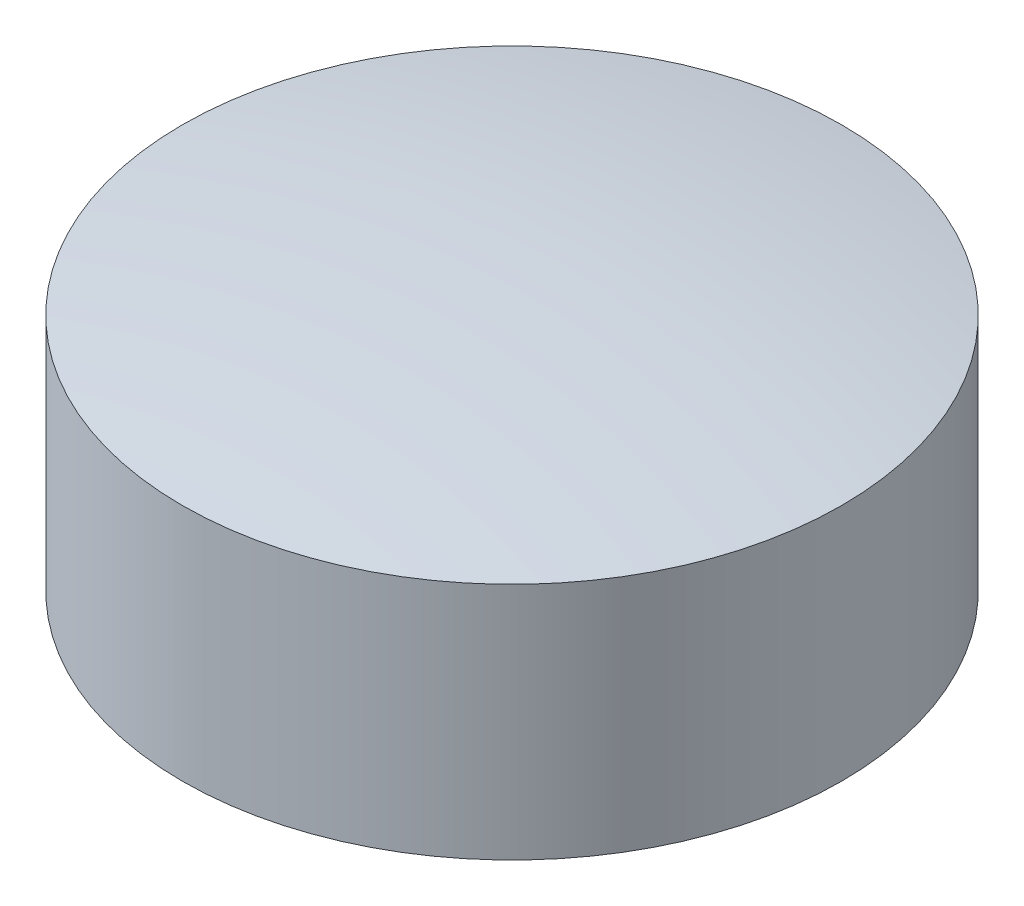
ISO-10303-21;
HEADER;
FILE_DESCRIPTION(('STEP AP214'),'2;1');
FILE_NAME('part.step','',(''),(''),'','','');
FILE_SCHEMA(('AUTOMOTIVE_DESIGN { 1 0 10303 214 1 1 1 1 }'));
ENDSEC;
DATA;
#1=APPLICATION_CONTEXT('core data for automotive mechanical design processes');
#2=APPLICATION_PROTOCOL_DEFINITION('international standard','automotive_design',2000,#1);
#3=PRODUCT_CONTEXT('',#1,'mechanical');
#4=PRODUCT('Part','Part','',(#3));
#5=PRODUCT_RELATED_PRODUCT_CATEGORY('part','',(#4));
#6=PRODUCT_DEFINITION_FORMATION('','',#4);
#7=PRODUCT_DEFINITION_CONTEXT('part definition',#1,'design');
#8=PRODUCT_DEFINITION('design','',#6,#7);
#9=PRODUCT_DEFINITION_SHAPE('','',#8);
#10=(LENGTH_UNIT() NAMED_UNIT(*) SI_UNIT(.MILLI.,.METRE.));
#11=(NAMED_UNIT(*) PLANE_ANGLE_UNIT() SI_UNIT($,.RADIAN.));
#12=(NAMED_UNIT(*) SI_UNIT($,.STERADIAN.) SOLID_ANGLE_UNIT());
#13=UNCERTAINTY_MEASURE_WITH_UNIT(LENGTH_MEASURE(1.E-05),#10,'distance_accuracy_value','');
#14=(GEOMETRIC_REPRESENTATION_CONTEXT(3) GLOBAL_UNCERTAINTY_ASSIGNED_CONTEXT((#13)) GLOBAL_UNIT_ASSIGNED_CONTEXT((#10,
#11,#12)) REPRESENTATION_CONTEXT('',''));
#15=CARTESIAN_POINT('',(0.,0.,0.));
#16=DIRECTION('',(0.,0.,1.));
#17=DIRECTION('',(1.,0.,0.));
#18=AXIS2_PLACEMENT_3D('',#15,#16,#17);
#19=CARTESIAN_POINT('',(14.8,0.,0.));
#20=DIRECTION('',(0.,1.,0.));
#21=DIRECTION('',(0.,0.,1.));
#22=AXIS2_PLACEMENT_3D('',#19,#20,#21);
#23=PLANE('',#22);
#24=CARTESIAN_POINT('',(0.,0.,0.));
#25=DIRECTION('',(0.,1.,0.));
#26=DIRECTION('',(0.,0.,1.));
#27=AXIS2_PLACEMENT_3D('',#24,#25,#26);
#28=CIRCLE('',#27,14.8);
#29=CARTESIAN_POINT('',(0.,0.,14.8));
#30=VERTEX_POINT('',#29);
#31=EDGE_CURVE('E17',#30,#30,#28,.T.);
#32=ORIENTED_EDGE('',*,*,#31,.F.);
#33=EDGE_LOOP('',(#32));
#34=FACE_BOUND('',#33,.T.);
#35=ADVANCED_FACE('F14',(#34),#23,.F.);
#36=CARTESIAN_POINT('',(3.06612374378901E-13,-67.899999999997,0.));
#37=DIRECTION('',(1.,0.,0.));
#38=DIRECTION('',(0.,0.,1.));
#39=AXIS2_PLACEMENT_3D('',#36,#37,#38);
#40=SPHERICAL_SURFACE('',#39,80.);
#41=CARTESIAN_POINT('',(0.,10.7190816532475,0.));
#42=DIRECTION('',(0.,1.,0.));
#43=DIRECTION('',(0.,0.,1.));
#44=AXIS2_PLACEMENT_3D('',#41,#42,#43);
#45=CIRCLE('',#44,14.8);
#46=CARTESIAN_POINT('',(0.,10.7190816532475,14.8));
#47=VERTEX_POINT('',#46);
#48=EDGE_CURVE('E10',#47,#47,#45,.F.);
#49=ORIENTED_EDGE('',*,*,#48,.F.);
#50=EDGE_LOOP('',(#49));
#51=FACE_BOUND('',#50,.T.);
#52=ADVANCED_FACE('F26',(#51),#40,.T.);
#53=CARTESIAN_POINT('',(0.,0.,0.));
#54=DIRECTION('',(0.,1.,0.));
#55=DIRECTION('',(0.,0.,1.));
#56=AXIS2_PLACEMENT_3D('',#53,#54,#55);
#57=CYLINDRICAL_SURFACE('',#56,14.8);
#58=ORIENTED_EDGE('',*,*,#48,.T.);
#59=EDGE_LOOP('',(#58));
#60=FACE_BOUND('',#59,.T.);
#61=ORIENTED_EDGE('',*,*,#31,.T.);
#62=EDGE_LOOP('',(#61));
#63=FACE_BOUND('',#62,.T.);
#64=ADVANCED_FACE('F29',(#60,#63),#57,.T.);
#65=CLOSED_SHELL('',(#35,#52,#64));
#66=MANIFOLD_SOLID_BREP('B1',#65);
#67=ADVANCED_BREP_SHAPE_REPRESENTATION('',(#18,#66),#14);
#68=SHAPE_DEFINITION_REPRESENTATION(#9,#67);
ENDSEC;
END-ISO-10303-21;
